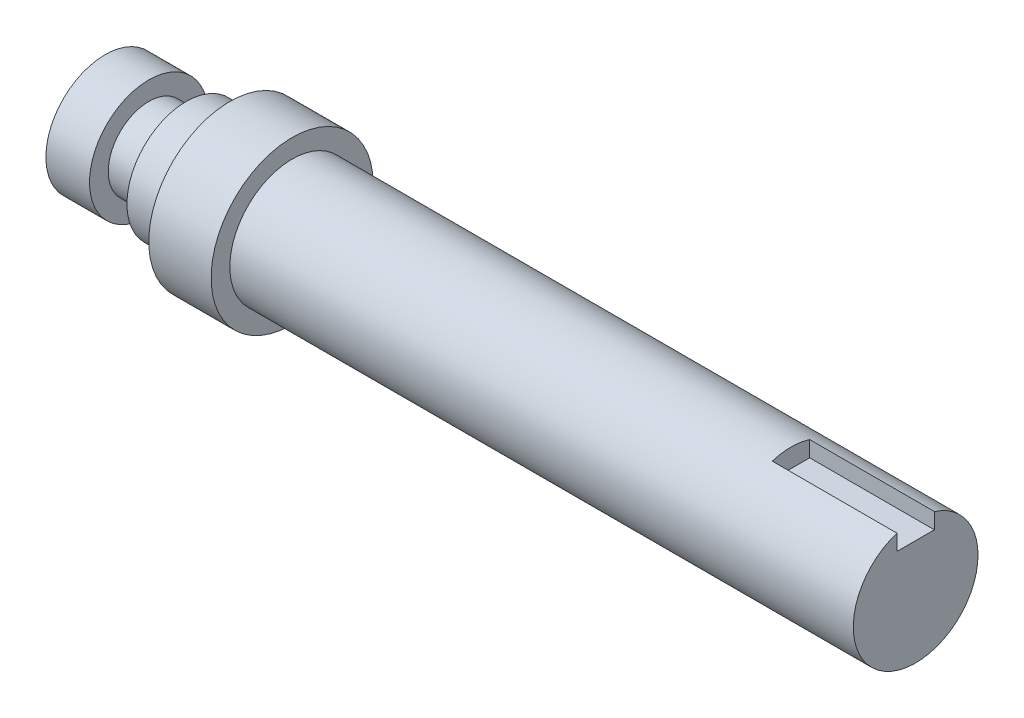
ISO-10303-21;
HEADER;
FILE_DESCRIPTION(('STEP AP214'),'2;1');
FILE_NAME('part.step','',(''),(''),'','','');
FILE_SCHEMA(('AUTOMOTIVE_DESIGN { 1 0 10303 214 1 1 1 1 }'));
ENDSEC;
DATA;
#1=APPLICATION_CONTEXT('core data for automotive mechanical design processes');
#2=APPLICATION_PROTOCOL_DEFINITION('international standard','automotive_design',2000,#1);
#3=PRODUCT_CONTEXT('',#1,'mechanical');
#4=PRODUCT('Part','Part','',(#3));
#5=PRODUCT_RELATED_PRODUCT_CATEGORY('part','',(#4));
#6=PRODUCT_DEFINITION_FORMATION('','',#4);
#7=PRODUCT_DEFINITION_CONTEXT('part definition',#1,'design');
#8=PRODUCT_DEFINITION('design','',#6,#7);
#9=PRODUCT_DEFINITION_SHAPE('','',#8);
#10=(LENGTH_UNIT() NAMED_UNIT(*) SI_UNIT(.MILLI.,.METRE.));
#11=(NAMED_UNIT(*) PLANE_ANGLE_UNIT() SI_UNIT($,.RADIAN.));
#12=(NAMED_UNIT(*) SI_UNIT($,.STERADIAN.) SOLID_ANGLE_UNIT());
#13=UNCERTAINTY_MEASURE_WITH_UNIT(LENGTH_MEASURE(1.E-05),#10,'distance_accuracy_value','');
#14=(GEOMETRIC_REPRESENTATION_CONTEXT(3) GLOBAL_UNCERTAINTY_ASSIGNED_CONTEXT((#13)) GLOBAL_UNIT_ASSIGNED_CONTEXT((#10,
#11,#12)) REPRESENTATION_CONTEXT('',''));
#15=CARTESIAN_POINT('',(0.,0.,0.));
#16=DIRECTION('',(0.,0.,1.));
#17=DIRECTION('',(1.,0.,0.));
#18=AXIS2_PLACEMENT_3D('',#15,#16,#17);
#19=CARTESIAN_POINT('',(0.,0.,-254.));
#20=DIRECTION('',(1.,0.,0.));
#21=DIRECTION('',(0.,0.,-1.));
#22=AXIS2_PLACEMENT_3D('',#19,#20,#21);
#23=PLANE('',#22);
#24=DIRECTION('',(0.,1.,0.));
#25=VECTOR('',#24,1.);
#26=CARTESIAN_POINT('',(0.,304.8,-76.2));
#27=LINE('',#26,#25);
#28=CARTESIAN_POINT('',(0.,177.8,-76.2));
#29=VERTEX_POINT('',#28);
#30=CARTESIAN_POINT('',(0.,242.300557159904,-76.2));
#31=VERTEX_POINT('',#30);
#32=EDGE_CURVE('E85',#29,#31,#27,.T.);
#33=ORIENTED_EDGE('',*,*,#32,.F.);
#34=DIRECTION('',(0.,0.,1.));
#35=VECTOR('',#34,1.);
#36=CARTESIAN_POINT('',(0.,177.8,-76.2));
#37=LINE('',#36,#35);
#38=CARTESIAN_POINT('',(0.,177.8,76.2));
#39=VERTEX_POINT('',#38);
#40=EDGE_CURVE('E93',#29,#39,#37,.T.);
#41=ORIENTED_EDGE('',*,*,#40,.T.);
#42=DIRECTION('',(0.,1.,0.));
#43=VECTOR('',#42,1.);
#44=CARTESIAN_POINT('',(0.,304.8,76.2));
#45=LINE('',#44,#43);
#46=CARTESIAN_POINT('',(0.,242.300557159904,76.2));
#47=VERTEX_POINT('',#46);
#48=EDGE_CURVE('E101',#39,#47,#45,.T.);
#49=ORIENTED_EDGE('',*,*,#48,.T.);
#50=CARTESIAN_POINT('',(0.,0.,0.));
#51=DIRECTION('',(1.,0.,0.));
#52=DIRECTION('',(0.,0.,-1.));
#53=AXIS2_PLACEMENT_3D('',#50,#51,#52);
#54=CIRCLE('',#53,254.);
#55=EDGE_CURVE('E111',#47,#31,#54,.T.);
#56=ORIENTED_EDGE('',*,*,#55,.T.);
#57=EDGE_LOOP('',(#33,#41,#49,#56));
#58=FACE_BOUND('',#57,.T.);
#59=ADVANCED_FACE('F39',(#58),#23,.T.);
#60=CARTESIAN_POINT('',(-3302.,0.,1.31546898217251E-13));
#61=DIRECTION('',(-1.,0.,0.));
#62=DIRECTION('',(0.,0.,1.));
#63=AXIS2_PLACEMENT_3D('',#60,#61,#62);
#64=PLANE('',#63);
#65=CARTESIAN_POINT('',(-3302.,0.,1.31546898217251E-13));
#66=DIRECTION('',(1.,0.,0.));
#67=DIRECTION('',(0.,0.,-1.));
#68=AXIS2_PLACEMENT_3D('',#65,#66,#67);
#69=CIRCLE('',#68,241.3);
#70=CARTESIAN_POINT('',(-3302.,0.,-241.3));
#71=VERTEX_POINT('',#70);
#72=EDGE_CURVE('E148',#71,#71,#69,.T.);
#73=ORIENTED_EDGE('',*,*,#72,.F.);
#74=EDGE_LOOP('',(#73));
#75=FACE_BOUND('',#74,.T.);
#76=ADVANCED_FACE('F164',(#75),#64,.T.);
#77=CARTESIAN_POINT('',(0.,0.,0.));
#78=DIRECTION('',(1.,0.,0.));
#79=DIRECTION('',(0.,0.,-1.));
#80=AXIS2_PLACEMENT_3D('',#77,#78,#79);
#81=CYLINDRICAL_SURFACE('',#80,241.3);
#82=ORIENTED_EDGE('',*,*,#72,.T.);
#83=EDGE_LOOP('',(#82));
#84=FACE_BOUND('',#83,.T.);
#85=CARTESIAN_POINT('',(-3124.2,0.,1.2446360369786E-13));
#86=DIRECTION('',(1.,0.,0.));
#87=DIRECTION('',(0.,0.,-1.));
#88=AXIS2_PLACEMENT_3D('',#85,#86,#87);
#89=CIRCLE('',#88,241.3);
#90=CARTESIAN_POINT('',(-3124.2,0.,-241.3));
#91=VERTEX_POINT('',#90);
#92=EDGE_CURVE('E144',#91,#91,#89,.T.);
#93=ORIENTED_EDGE('',*,*,#92,.F.);
#94=EDGE_LOOP('',(#93));
#95=FACE_BOUND('',#94,.T.);
#96=ADVANCED_FACE('F168',(#84,#95),#81,.T.);
#97=CARTESIAN_POINT('',(-3124.2,0.,-241.3));
#98=DIRECTION('',(1.,0.,0.));
#99=DIRECTION('',(0.,0.,-1.));
#100=AXIS2_PLACEMENT_3D('',#97,#98,#99);
#101=PLANE('',#100);
#102=ORIENTED_EDGE('',*,*,#92,.T.);
#103=EDGE_LOOP('',(#102));
#104=FACE_BOUND('',#103,.T.);
#105=CARTESIAN_POINT('',(-3124.2,0.,1.2446360369786E-13));
#106=DIRECTION('',(1.,0.,0.));
#107=DIRECTION('',(0.,0.,-1.));
#108=AXIS2_PLACEMENT_3D('',#105,#106,#107);
#109=CIRCLE('',#108,165.1);
#110=CARTESIAN_POINT('',(-3124.2,0.,-165.1));
#111=VERTEX_POINT('',#110);
#112=EDGE_CURVE('E140',#111,#111,#109,.T.);
#113=ORIENTED_EDGE('',*,*,#112,.F.);
#114=EDGE_LOOP('',(#113));
#115=FACE_BOUND('',#114,.T.);
#116=ADVANCED_FACE('F173',(#104,#115),#101,.T.);
#117=CARTESIAN_POINT('',(0.,0.,0.));
#118=DIRECTION('',(1.,0.,0.));
#119=DIRECTION('',(0.,0.,-1.));
#120=AXIS2_PLACEMENT_3D('',#117,#118,#119);
#121=CYLINDRICAL_SURFACE('',#120,165.1);
#122=ORIENTED_EDGE('',*,*,#112,.T.);
#123=EDGE_LOOP('',(#122));
#124=FACE_BOUND('',#123,.T.);
#125=CARTESIAN_POINT('',(-2971.8,0.,1.18392208395526E-13));
#126=DIRECTION('',(1.,0.,0.));
#127=DIRECTION('',(0.,0.,-1.));
#128=AXIS2_PLACEMENT_3D('',#125,#126,#127);
#129=CIRCLE('',#128,165.1);
#130=CARTESIAN_POINT('',(-2971.8,0.,-165.1));
#131=VERTEX_POINT('',#130);
#132=EDGE_CURVE('E136',#131,#131,#129,.T.);
#133=ORIENTED_EDGE('',*,*,#132,.F.);
#134=EDGE_LOOP('',(#133));
#135=FACE_BOUND('',#134,.T.);
#136=ADVANCED_FACE('F180',(#124,#135),#121,.T.);
#137=CARTESIAN_POINT('',(-2971.8,0.,-165.1));
#138=DIRECTION('',(-1.,0.,0.));
#139=DIRECTION('',(0.,0.,1.));
#140=AXIS2_PLACEMENT_3D('',#137,#138,#139);
#141=PLANE('',#140);
#142=ORIENTED_EDGE('',*,*,#132,.T.);
#143=EDGE_LOOP('',(#142));
#144=FACE_BOUND('',#143,.T.);
#145=CARTESIAN_POINT('',(-2971.8,0.,1.18392208395526E-13));
#146=DIRECTION('',(1.,0.,0.));
#147=DIRECTION('',(0.,0.,-1.));
#148=AXIS2_PLACEMENT_3D('',#145,#146,#147);
#149=CIRCLE('',#148,241.3);
#150=CARTESIAN_POINT('',(-2971.8,0.,-241.3));
#151=VERTEX_POINT('',#150);
#152=EDGE_CURVE('E132',#151,#151,#149,.T.);
#153=ORIENTED_EDGE('',*,*,#152,.F.);
#154=EDGE_LOOP('',(#153));
#155=FACE_BOUND('',#154,.T.);
#156=ADVANCED_FACE('F184',(#144,#155),#141,.T.);
#157=CARTESIAN_POINT('',(0.,0.,0.));
#158=DIRECTION('',(1.,0.,0.));
#159=DIRECTION('',(0.,0.,-1.));
#160=AXIS2_PLACEMENT_3D('',#157,#158,#159);
#161=CYLINDRICAL_SURFACE('',#160,241.3);
#162=ORIENTED_EDGE('',*,*,#152,.T.);
#163=EDGE_LOOP('',(#162));
#164=FACE_BOUND('',#163,.T.);
#165=CARTESIAN_POINT('',(-2794.,0.,1.11308913876135E-13));
#166=DIRECTION('',(1.,0.,0.));
#167=DIRECTION('',(0.,0.,-1.));
#168=AXIS2_PLACEMENT_3D('',#165,#166,#167);
#169=CIRCLE('',#168,241.3);
#170=CARTESIAN_POINT('',(-2794.,0.,-241.3));
#171=VERTEX_POINT('',#170);
#172=EDGE_CURVE('E128',#171,#171,#169,.T.);
#173=ORIENTED_EDGE('',*,*,#172,.F.);
#174=EDGE_LOOP('',(#173));
#175=FACE_BOUND('',#174,.T.);
#176=ADVANCED_FACE('F188',(#164,#175),#161,.T.);
#177=CARTESIAN_POINT('',(-2794.,0.,-241.3));
#178=DIRECTION('',(-1.,0.,0.));
#179=DIRECTION('',(0.,0.,1.));
#180=AXIS2_PLACEMENT_3D('',#177,#178,#179);
#181=PLANE('',#180);
#182=ORIENTED_EDGE('',*,*,#172,.T.);
#183=EDGE_LOOP('',(#182));
#184=FACE_BOUND('',#183,.T.);
#185=CARTESIAN_POINT('',(-2794.,0.,1.11308913876135E-13));
#186=DIRECTION('',(1.,0.,0.));
#187=DIRECTION('',(0.,0.,-1.));
#188=AXIS2_PLACEMENT_3D('',#185,#186,#187);
#189=CIRCLE('',#188,330.2);
#190=CARTESIAN_POINT('',(-2794.,0.,-330.2));
#191=VERTEX_POINT('',#190);
#192=EDGE_CURVE('E124',#191,#191,#189,.T.);
#193=ORIENTED_EDGE('',*,*,#192,.F.);
#194=EDGE_LOOP('',(#193));
#195=FACE_BOUND('',#194,.T.);
#196=ADVANCED_FACE('F192',(#184,#195),#181,.T.);
#197=CARTESIAN_POINT('',(0.,0.,0.));
#198=DIRECTION('',(1.,0.,0.));
#199=DIRECTION('',(0.,0.,-1.));
#200=AXIS2_PLACEMENT_3D('',#197,#198,#199);
#201=CYLINDRICAL_SURFACE('',#200,330.2);
#202=ORIENTED_EDGE('',*,*,#192,.T.);
#203=EDGE_LOOP('',(#202));
#204=FACE_BOUND('',#203,.T.);
#205=CARTESIAN_POINT('',(-2540.,0.,1.01189921705577E-13));
#206=DIRECTION('',(1.,0.,0.));
#207=DIRECTION('',(0.,0.,-1.));
#208=AXIS2_PLACEMENT_3D('',#205,#206,#207);
#209=CIRCLE('',#208,330.2);
#210=CARTESIAN_POINT('',(-2540.,0.,-330.2));
#211=VERTEX_POINT('',#210);
#212=EDGE_CURVE('E120',#211,#211,#209,.T.);
#213=ORIENTED_EDGE('',*,*,#212,.F.);
#214=EDGE_LOOP('',(#213));
#215=FACE_BOUND('',#214,.T.);
#216=ADVANCED_FACE('F196',(#204,#215),#201,.T.);
#217=CARTESIAN_POINT('',(-2540.,0.,-330.2));
#218=DIRECTION('',(1.,0.,0.));
#219=DIRECTION('',(0.,0.,-1.));
#220=AXIS2_PLACEMENT_3D('',#217,#218,#219);
#221=PLANE('',#220);
#222=ORIENTED_EDGE('',*,*,#212,.T.);
#223=EDGE_LOOP('',(#222));
#224=FACE_BOUND('',#223,.T.);
#225=CARTESIAN_POINT('',(-2540.,0.,1.01189921705577E-13));
#226=DIRECTION('',(1.,0.,0.));
#227=DIRECTION('',(0.,0.,-1.));
#228=AXIS2_PLACEMENT_3D('',#225,#226,#227);
#229=CIRCLE('',#228,254.);
#230=CARTESIAN_POINT('',(-2540.,0.,-254.));
#231=VERTEX_POINT('',#230);
#232=EDGE_CURVE('E116',#231,#231,#229,.T.);
#233=ORIENTED_EDGE('',*,*,#232,.F.);
#234=EDGE_LOOP('',(#233));
#235=FACE_BOUND('',#234,.T.);
#236=ADVANCED_FACE('F200',(#224,#235),#221,.T.);
#237=CARTESIAN_POINT('',(0.,0.,0.));
#238=DIRECTION('',(1.,0.,0.));
#239=DIRECTION('',(0.,0.,-1.));
#240=AXIS2_PLACEMENT_3D('',#237,#238,#239);
#241=CYLINDRICAL_SURFACE('',#240,254.);
#242=DIRECTION('',(1.,0.,0.));
#243=VECTOR('',#242,1.);
#244=CARTESIAN_POINT('',(0.,242.300557159904,-76.2));
#245=LINE('',#244,#243);
#246=CARTESIAN_POINT('',(-508.,242.300557159904,-76.2));
#247=VERTEX_POINT('',#246);
#248=EDGE_CURVE('E11',#31,#247,#245,.F.);
#249=ORIENTED_EDGE('',*,*,#248,.F.);
#250=ORIENTED_EDGE('',*,*,#55,.F.);
#251=DIRECTION('',(1.,0.,0.));
#252=VECTOR('',#251,1.);
#253=CARTESIAN_POINT('',(0.,242.300557159904,76.2));
#254=LINE('',#253,#252);
#255=CARTESIAN_POINT('',(-508.,242.300557159904,76.2));
#256=VERTEX_POINT('',#255);
#257=EDGE_CURVE('E152',#47,#256,#254,.F.);
#258=ORIENTED_EDGE('',*,*,#257,.T.);
#259=CARTESIAN_POINT('',(-508.,0.,0.));
#260=DIRECTION('',(-1.,0.,0.));
#261=DIRECTION('',(0.,0.,1.));
#262=AXIS2_PLACEMENT_3D('',#259,#260,#261);
#263=CIRCLE('',#262,254.);
#264=EDGE_CURVE('E47',#247,#256,#263,.F.);
#265=ORIENTED_EDGE('',*,*,#264,.F.);
#266=EDGE_LOOP('',(#249,#250,#258,#265));
#267=FACE_BOUND('',#266,.T.);
#268=ORIENTED_EDGE('',*,*,#232,.T.);
#269=EDGE_LOOP('',(#268));
#270=FACE_BOUND('',#269,.T.);
#271=ADVANCED_FACE('F158',(#267,#270),#241,.T.);
#272=CARTESIAN_POINT('',(0.,177.8,-76.2));
#273=DIRECTION('',(0.,-1.,0.));
#274=DIRECTION('',(1.,0.,0.));
#275=AXIS2_PLACEMENT_3D('',#272,#273,#274);
#276=PLANE('',#275);
#277=DIRECTION('',(1.,0.,0.));
#278=VECTOR('',#277,1.);
#279=CARTESIAN_POINT('',(0.,177.8,76.2));
#280=LINE('',#279,#278);
#281=CARTESIAN_POINT('',(-508.,177.8,76.2));
#282=VERTEX_POINT('',#281);
#283=EDGE_CURVE('E107',#282,#39,#280,.T.);
#284=ORIENTED_EDGE('',*,*,#283,.T.);
#285=ORIENTED_EDGE('',*,*,#40,.F.);
#286=DIRECTION('',(1.,0.,0.));
#287=VECTOR('',#286,1.);
#288=CARTESIAN_POINT('',(0.,177.8,-76.2));
#289=LINE('',#288,#287);
#290=CARTESIAN_POINT('',(-508.,177.8,-76.2));
#291=VERTEX_POINT('',#290);
#292=EDGE_CURVE('E80',#291,#29,#289,.T.);
#293=ORIENTED_EDGE('',*,*,#292,.F.);
#294=DIRECTION('',(0.,0.,1.));
#295=VECTOR('',#294,1.);
#296=CARTESIAN_POINT('',(-508.,177.8,-76.2));
#297=LINE('',#296,#295);
#298=EDGE_CURVE('E88',#291,#282,#297,.T.);
#299=ORIENTED_EDGE('',*,*,#298,.T.);
#300=EDGE_LOOP('',(#284,#285,#293,#299));
#301=FACE_BOUND('',#300,.T.);
#302=ADVANCED_FACE('F95',(#301),#276,.F.);
#303=CARTESIAN_POINT('',(-508.,304.8,-76.2));
#304=DIRECTION('',(-1.,0.,0.));
#305=DIRECTION('',(0.,0.,1.));
#306=AXIS2_PLACEMENT_3D('',#303,#304,#305);
#307=PLANE('',#306);
#308=ORIENTED_EDGE('',*,*,#264,.T.);
#309=DIRECTION('',(0.,-1.,0.));
#310=VECTOR('',#309,1.);
#311=CARTESIAN_POINT('',(-508.,304.8,76.2));
#312=LINE('',#311,#310);
#313=EDGE_CURVE('E54',#256,#282,#312,.T.);
#314=ORIENTED_EDGE('',*,*,#313,.T.);
#315=ORIENTED_EDGE('',*,*,#298,.F.);
#316=DIRECTION('',(0.,-1.,0.));
#317=VECTOR('',#316,1.);
#318=CARTESIAN_POINT('',(-508.,304.8,-76.2));
#319=LINE('',#318,#317);
#320=EDGE_CURVE('E76',#247,#291,#319,.T.);
#321=ORIENTED_EDGE('',*,*,#320,.F.);
#322=EDGE_LOOP('',(#308,#314,#315,#321));
#323=FACE_BOUND('',#322,.T.);
#324=ADVANCED_FACE('F89',(#323),#307,.F.);
#325=CARTESIAN_POINT('',(0.,0.,-76.2));
#326=DIRECTION('',(0.,0.,-1.));
#327=DIRECTION('',(-1.,0.,0.));
#328=AXIS2_PLACEMENT_3D('',#325,#326,#327);
#329=PLANE('',#328);
#330=ORIENTED_EDGE('',*,*,#248,.T.);
#331=ORIENTED_EDGE('',*,*,#320,.T.);
#332=ORIENTED_EDGE('',*,*,#292,.T.);
#333=ORIENTED_EDGE('',*,*,#32,.T.);
#334=EDGE_LOOP('',(#330,#331,#332,#333));
#335=FACE_BOUND('',#334,.T.);
#336=ADVANCED_FACE('F78',(#335),#329,.F.);
#337=CARTESIAN_POINT('',(0.,0.,76.2));
#338=DIRECTION('',(0.,0.,-1.));
#339=DIRECTION('',(-1.,0.,0.));
#340=AXIS2_PLACEMENT_3D('',#337,#338,#339);
#341=PLANE('',#340);
#342=ORIENTED_EDGE('',*,*,#48,.F.);
#343=ORIENTED_EDGE('',*,*,#283,.F.);
#344=ORIENTED_EDGE('',*,*,#313,.F.);
#345=ORIENTED_EDGE('',*,*,#257,.F.);
#346=EDGE_LOOP('',(#342,#343,#344,#345));
#347=FACE_BOUND('',#346,.T.);
#348=ADVANCED_FACE('F160',(#347),#341,.T.);
#349=CLOSED_SHELL('',(#59,#76,#96,#116,#136,#156,#176,#196,#216,#236,#271,#302,#324,#336,#348));
#350=MANIFOLD_SOLID_BREP('B2',#349);
#351=ADVANCED_BREP_SHAPE_REPRESENTATION('',(#18,#350),#14);
#352=SHAPE_DEFINITION_REPRESENTATION(#9,#351);
ENDSEC;
END-ISO-10303-21;
